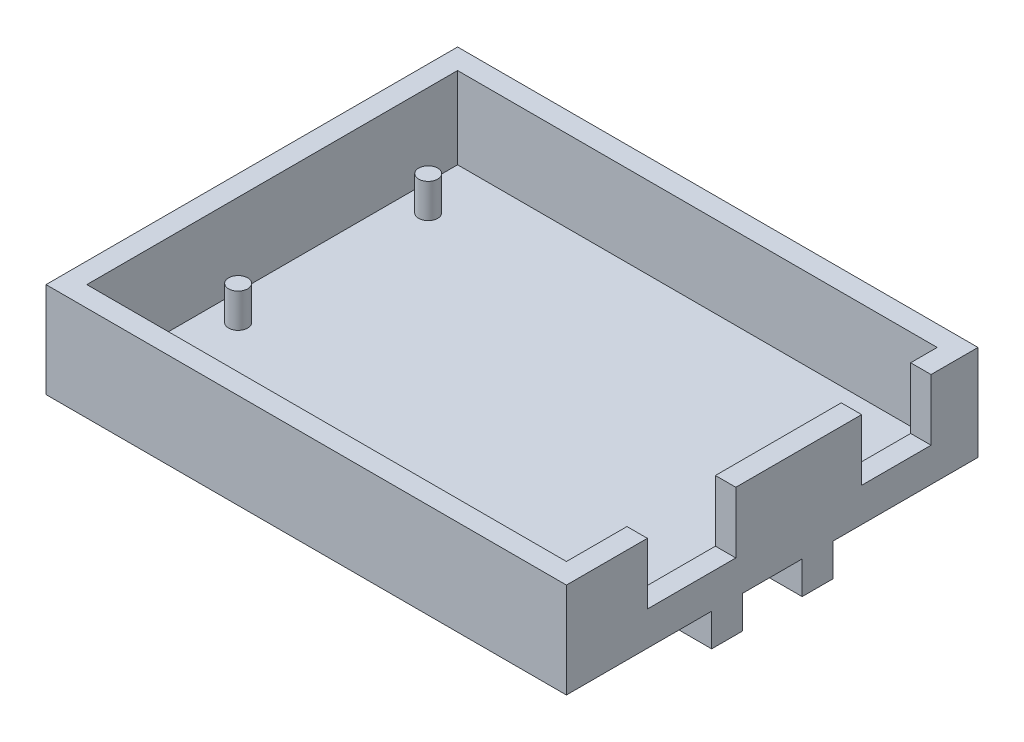
ISO-10303-21;
HEADER;
FILE_DESCRIPTION(('STEP AP214'),'2;1');
FILE_NAME('part.step','',(''),(''),'','','');
FILE_SCHEMA(('AUTOMOTIVE_DESIGN { 1 0 10303 214 1 1 1 1 }'));
ENDSEC;
DATA;
#1=APPLICATION_CONTEXT('core data for automotive mechanical design processes');
#2=APPLICATION_PROTOCOL_DEFINITION('international standard','automotive_design',2000,#1);
#3=PRODUCT_CONTEXT('',#1,'mechanical');
#4=PRODUCT('Part','Part','',(#3));
#5=PRODUCT_RELATED_PRODUCT_CATEGORY('part','',(#4));
#6=PRODUCT_DEFINITION_FORMATION('','',#4);
#7=PRODUCT_DEFINITION_CONTEXT('part definition',#1,'design');
#8=PRODUCT_DEFINITION('design','',#6,#7);
#9=PRODUCT_DEFINITION_SHAPE('','',#8);
#10=(LENGTH_UNIT() NAMED_UNIT(*) SI_UNIT(.MILLI.,.METRE.));
#11=(NAMED_UNIT(*) PLANE_ANGLE_UNIT() SI_UNIT($,.RADIAN.));
#12=(NAMED_UNIT(*) SI_UNIT($,.STERADIAN.) SOLID_ANGLE_UNIT());
#13=UNCERTAINTY_MEASURE_WITH_UNIT(LENGTH_MEASURE(1.E-05),#10,'distance_accuracy_value','');
#14=(GEOMETRIC_REPRESENTATION_CONTEXT(3) GLOBAL_UNCERTAINTY_ASSIGNED_CONTEXT((#13)) GLOBAL_UNIT_ASSIGNED_CONTEXT((#10,
#11,#12)) REPRESENTATION_CONTEXT('',''));
#15=CARTESIAN_POINT('',(0.,0.,0.));
#16=DIRECTION('',(0.,0.,1.));
#17=DIRECTION('',(1.,0.,0.));
#18=AXIS2_PLACEMENT_3D('',#15,#16,#17);
#19=CARTESIAN_POINT('',(0.,0.,0.));
#20=DIRECTION('',(0.,-1.,0.));
#21=DIRECTION('',(0.,0.,-1.));
#22=AXIS2_PLACEMENT_3D('',#19,#20,#21);
#23=PLANE('',#22);
#24=DIRECTION('',(-1.,0.,0.));
#25=VECTOR('',#24,1.);
#26=CARTESIAN_POINT('',(-38.25,0.,-8.9));
#27=LINE('',#26,#25);
#28=CARTESIAN_POINT('',(38.25,0.,-8.90000000000001));
#29=VERTEX_POINT('',#28);
#30=CARTESIAN_POINT('',(-38.25,0.,-8.90000000000001));
#31=VERTEX_POINT('',#30);
#32=EDGE_CURVE('E232',#29,#31,#27,.T.);
#33=ORIENTED_EDGE('',*,*,#32,.T.);
#34=DIRECTION('',(0.,0.,1.));
#35=VECTOR('',#34,1.);
#36=CARTESIAN_POINT('',(-38.25,0.,30.25));
#37=LINE('',#36,#35);
#38=CARTESIAN_POINT('',(-38.25,0.,-30.25));
#39=VERTEX_POINT('',#38);
#40=EDGE_CURVE('E208',#39,#31,#37,.T.);
#41=ORIENTED_EDGE('',*,*,#40,.F.);
#42=DIRECTION('',(-1.,0.,0.));
#43=VECTOR('',#42,1.);
#44=CARTESIAN_POINT('',(-38.25,0.,-30.25));
#45=LINE('',#44,#43);
#46=CARTESIAN_POINT('',(38.25,0.,-30.25));
#47=VERTEX_POINT('',#46);
#48=EDGE_CURVE('E365',#47,#39,#45,.T.);
#49=ORIENTED_EDGE('',*,*,#48,.F.);
#50=DIRECTION('',(0.,0.,-1.));
#51=VECTOR('',#50,1.);
#52=CARTESIAN_POINT('',(38.25,0.,30.25));
#53=LINE('',#52,#51);
#54=EDGE_CURVE('E53',#29,#47,#53,.T.);
#55=ORIENTED_EDGE('',*,*,#54,.F.);
#56=EDGE_LOOP('',(#33,#41,#49,#55));
#57=FACE_BOUND('',#56,.T.);
#58=ADVANCED_FACE('F38',(#57),#23,.T.);
#59=DIRECTION('',(-1.,0.,0.));
#60=VECTOR('',#59,1.);
#61=CARTESIAN_POINT('',(-38.25,0.,8.9));
#62=LINE('',#61,#60);
#63=CARTESIAN_POINT('',(38.25,0.,8.9));
#64=VERTEX_POINT('',#63);
#65=CARTESIAN_POINT('',(-38.25,0.,8.9));
#66=VERTEX_POINT('',#65);
#67=EDGE_CURVE('E245',#64,#66,#62,.T.);
#68=ORIENTED_EDGE('',*,*,#67,.F.);
#69=CARTESIAN_POINT('',(38.25,0.,30.25));
#70=VERTEX_POINT('',#69);
#71=EDGE_CURVE('E362',#70,#64,#53,.T.);
#72=ORIENTED_EDGE('',*,*,#71,.F.);
#73=DIRECTION('',(1.,0.,0.));
#74=VECTOR('',#73,1.);
#75=CARTESIAN_POINT('',(-38.25,0.,30.25));
#76=LINE('',#75,#74);
#77=CARTESIAN_POINT('',(-38.25,0.,30.25));
#78=VERTEX_POINT('',#77);
#79=EDGE_CURVE('E370',#78,#70,#76,.T.);
#80=ORIENTED_EDGE('',*,*,#79,.F.);
#81=EDGE_CURVE('E368',#66,#78,#37,.T.);
#82=ORIENTED_EDGE('',*,*,#81,.F.);
#83=EDGE_LOOP('',(#68,#72,#80,#82));
#84=FACE_BOUND('',#83,.T.);
#85=ADVANCED_FACE('F407',(#84),#23,.T.);
#86=CARTESIAN_POINT('',(0.,14.,0.));
#87=DIRECTION('',(0.,-1.,0.));
#88=DIRECTION('',(0.,0.,-1.));
#89=AXIS2_PLACEMENT_3D('',#86,#87,#88);
#90=PLANE('',#89);
#91=DIRECTION('',(0.,0.,-1.));
#92=VECTOR('',#91,1.);
#93=CARTESIAN_POINT('',(35.25,14.,-27.25));
#94=LINE('',#93,#92);
#95=CARTESIAN_POINT('',(35.25,14.,5.35));
#96=VERTEX_POINT('',#95);
#97=CARTESIAN_POINT('',(35.25,14.,-13.15));
#98=VERTEX_POINT('',#97);
#99=EDGE_CURVE('E334',#96,#98,#94,.T.);
#100=ORIENTED_EDGE('',*,*,#99,.F.);
#101=DIRECTION('',(1.,0.,0.));
#102=VECTOR('',#101,1.);
#103=CARTESIAN_POINT('',(-38.251,14.,5.35));
#104=LINE('',#103,#102);
#105=CARTESIAN_POINT('',(38.25,14.,5.35));
#106=VERTEX_POINT('',#105);
#107=EDGE_CURVE('E283',#96,#106,#104,.T.);
#108=ORIENTED_EDGE('',*,*,#107,.T.);
#109=DIRECTION('',(0.,0.,-1.));
#110=VECTOR('',#109,1.);
#111=CARTESIAN_POINT('',(38.25,14.,30.25));
#112=LINE('',#111,#110);
#113=CARTESIAN_POINT('',(38.25,14.,-13.15));
#114=VERTEX_POINT('',#113);
#115=EDGE_CURVE('E354',#106,#114,#112,.T.);
#116=ORIENTED_EDGE('',*,*,#115,.T.);
#117=DIRECTION('',(1.,0.,0.));
#118=VECTOR('',#117,1.);
#119=CARTESIAN_POINT('',(-38.251,14.,-13.15));
#120=LINE('',#119,#118);
#121=EDGE_CURVE('E298',#98,#114,#120,.T.);
#122=ORIENTED_EDGE('',*,*,#121,.F.);
#123=EDGE_LOOP('',(#100,#108,#116,#122));
#124=FACE_BOUND('',#123,.T.);
#125=ADVANCED_FACE('F423',(#124),#90,.F.);
#126=CARTESIAN_POINT('',(38.25,14.,30.25));
#127=DIRECTION('',(-1.,0.,0.));
#128=DIRECTION('',(0.,0.,1.));
#129=AXIS2_PLACEMENT_3D('',#126,#127,#128);
#130=PLANE('',#129);
#131=ORIENTED_EDGE('',*,*,#115,.F.);
#132=DIRECTION('',(0.,1.,0.));
#133=VECTOR('',#132,1.);
#134=CARTESIAN_POINT('',(38.25,14.,5.35));
#135=LINE('',#134,#133);
#136=CARTESIAN_POINT('',(38.25,5.,5.35));
#137=VERTEX_POINT('',#136);
#138=EDGE_CURVE('E280',#137,#106,#135,.T.);
#139=ORIENTED_EDGE('',*,*,#138,.F.);
#140=DIRECTION('',(0.,0.,-1.));
#141=VECTOR('',#140,1.);
#142=CARTESIAN_POINT('',(38.25,5.,18.35));
#143=LINE('',#142,#141);
#144=CARTESIAN_POINT('',(38.25,5.,18.35));
#145=VERTEX_POINT('',#144);
#146=EDGE_CURVE('E277',#145,#137,#143,.T.);
#147=ORIENTED_EDGE('',*,*,#146,.F.);
#148=DIRECTION('',(0.,-1.,0.));
#149=VECTOR('',#148,1.);
#150=CARTESIAN_POINT('',(38.25,14.,18.35));
#151=LINE('',#150,#149);
#152=CARTESIAN_POINT('',(38.25,14.,18.35));
#153=VERTEX_POINT('',#152);
#154=EDGE_CURVE('E274',#153,#145,#151,.T.);
#155=ORIENTED_EDGE('',*,*,#154,.F.);
#156=CARTESIAN_POINT('',(38.25,14.,30.25));
#157=VERTEX_POINT('',#156);
#158=EDGE_CURVE('E350',#157,#153,#112,.T.);
#159=ORIENTED_EDGE('',*,*,#158,.F.);
#160=DIRECTION('',(0.,-1.,0.));
#161=VECTOR('',#160,1.);
#162=CARTESIAN_POINT('',(38.25,14.,30.25));
#163=LINE('',#162,#161);
#164=EDGE_CURVE('E361',#157,#70,#163,.T.);
#165=ORIENTED_EDGE('',*,*,#164,.T.);
#166=ORIENTED_EDGE('',*,*,#71,.T.);
#167=DIRECTION('',(0.,1.,0.));
#168=VECTOR('',#167,1.);
#169=CARTESIAN_POINT('',(38.25,-4.8,8.9));
#170=LINE('',#169,#168);
#171=CARTESIAN_POINT('',(38.25,-4.8,8.9));
#172=VERTEX_POINT('',#171);
#173=EDGE_CURVE('E258',#172,#64,#170,.T.);
#174=ORIENTED_EDGE('',*,*,#173,.F.);
#175=DIRECTION('',(0.,0.,1.));
#176=VECTOR('',#175,1.);
#177=CARTESIAN_POINT('',(38.25,-4.8,4.4));
#178=LINE('',#177,#176);
#179=CARTESIAN_POINT('',(38.25,-4.8,4.4));
#180=VERTEX_POINT('',#179);
#181=EDGE_CURVE('E247',#180,#172,#178,.T.);
#182=ORIENTED_EDGE('',*,*,#181,.F.);
#183=DIRECTION('',(0.,1.,0.));
#184=VECTOR('',#183,1.);
#185=CARTESIAN_POINT('',(38.25,-4.8,4.4));
#186=LINE('',#185,#184);
#187=CARTESIAN_POINT('',(38.25,0.,4.4));
#188=VERTEX_POINT('',#187);
#189=EDGE_CURVE('E261',#180,#188,#186,.T.);
#190=ORIENTED_EDGE('',*,*,#189,.T.);
#191=CARTESIAN_POINT('',(38.25,0.,-4.4));
#192=VERTEX_POINT('',#191);
#193=EDGE_CURVE('E366',#188,#192,#53,.T.);
#194=ORIENTED_EDGE('',*,*,#193,.T.);
#195=DIRECTION('',(0.,1.,0.));
#196=VECTOR('',#195,1.);
#197=CARTESIAN_POINT('',(38.25,-4.8,-4.4));
#198=LINE('',#197,#196);
#199=CARTESIAN_POINT('',(38.25,-4.8,-4.4));
#200=VERTEX_POINT('',#199);
#201=EDGE_CURVE('E237',#200,#192,#198,.T.);
#202=ORIENTED_EDGE('',*,*,#201,.F.);
#203=DIRECTION('',(0.,0.,-1.));
#204=VECTOR('',#203,1.);
#205=CARTESIAN_POINT('',(38.25,-4.8,-4.4));
#206=LINE('',#205,#204);
#207=CARTESIAN_POINT('',(38.25,-4.8,-8.9));
#208=VERTEX_POINT('',#207);
#209=EDGE_CURVE('E225',#200,#208,#206,.T.);
#210=ORIENTED_EDGE('',*,*,#209,.T.);
#211=DIRECTION('',(0.,1.,0.));
#212=VECTOR('',#211,1.);
#213=CARTESIAN_POINT('',(38.25,-4.8,-8.9));
#214=LINE('',#213,#212);
#215=EDGE_CURVE('E213',#208,#29,#214,.T.);
#216=ORIENTED_EDGE('',*,*,#215,.T.);
#217=ORIENTED_EDGE('',*,*,#54,.T.);
#218=DIRECTION('',(0.,-1.,0.));
#219=VECTOR('',#218,1.);
#220=CARTESIAN_POINT('',(38.25,14.,-30.25));
#221=LINE('',#220,#219);
#222=CARTESIAN_POINT('',(38.25,14.,-30.25));
#223=VERTEX_POINT('',#222);
#224=EDGE_CURVE('E11',#223,#47,#221,.T.);
#225=ORIENTED_EDGE('',*,*,#224,.F.);
#226=CARTESIAN_POINT('',(38.25,14.,-23.35));
#227=VERTEX_POINT('',#226);
#228=EDGE_CURVE('E355',#227,#223,#112,.T.);
#229=ORIENTED_EDGE('',*,*,#228,.F.);
#230=DIRECTION('',(0.,1.,0.));
#231=VECTOR('',#230,1.);
#232=CARTESIAN_POINT('',(38.25,14.,-23.35));
#233=LINE('',#232,#231);
#234=CARTESIAN_POINT('',(38.25,5.,-23.35));
#235=VERTEX_POINT('',#234);
#236=EDGE_CURVE('E308',#235,#227,#233,.T.);
#237=ORIENTED_EDGE('',*,*,#236,.F.);
#238=DIRECTION('',(0.,0.,-1.));
#239=VECTOR('',#238,1.);
#240=CARTESIAN_POINT('',(38.25,5.,-23.35));
#241=LINE('',#240,#239);
#242=CARTESIAN_POINT('',(38.25,5.,-13.15));
#243=VERTEX_POINT('',#242);
#244=EDGE_CURVE('E297',#243,#235,#241,.T.);
#245=ORIENTED_EDGE('',*,*,#244,.F.);
#246=DIRECTION('',(0.,-1.,0.));
#247=VECTOR('',#246,1.);
#248=CARTESIAN_POINT('',(38.25,14.,-13.15));
#249=LINE('',#248,#247);
#250=EDGE_CURVE('E305',#114,#243,#249,.T.);
#251=ORIENTED_EDGE('',*,*,#250,.F.);
#252=EDGE_LOOP('',(#131,#139,#147,#155,#159,#165,#166,#174,#182,#190,#194,#202,#210,#216,#217,
#225,#229,#237,#245,#251));
#253=FACE_BOUND('',#252,.T.);
#254=ADVANCED_FACE('F40',(#253),#130,.F.);
#255=CARTESIAN_POINT('',(-38.25,14.,-30.25));
#256=DIRECTION('',(0.,0.,1.));
#257=DIRECTION('',(1.,0.,0.));
#258=AXIS2_PLACEMENT_3D('',#255,#256,#257);
#259=PLANE('',#258);
#260=ORIENTED_EDGE('',*,*,#48,.T.);
#261=DIRECTION('',(0.,-1.,0.));
#262=VECTOR('',#261,1.);
#263=CARTESIAN_POINT('',(-38.25,14.,-30.25));
#264=LINE('',#263,#262);
#265=CARTESIAN_POINT('',(-38.25,14.,-30.25));
#266=VERTEX_POINT('',#265);
#267=EDGE_CURVE('E46',#266,#39,#264,.T.);
#268=ORIENTED_EDGE('',*,*,#267,.F.);
#269=DIRECTION('',(-1.,0.,0.));
#270=VECTOR('',#269,1.);
#271=CARTESIAN_POINT('',(-38.25,14.,-30.25));
#272=LINE('',#271,#270);
#273=EDGE_CURVE('E353',#223,#266,#272,.T.);
#274=ORIENTED_EDGE('',*,*,#273,.F.);
#275=ORIENTED_EDGE('',*,*,#224,.T.);
#276=EDGE_LOOP('',(#260,#268,#274,#275));
#277=FACE_BOUND('',#276,.T.);
#278=ADVANCED_FACE('F383',(#277),#259,.F.);
#279=CARTESIAN_POINT('',(-38.25,14.,30.25));
#280=DIRECTION('',(1.,0.,0.));
#281=DIRECTION('',(0.,0.,-1.));
#282=AXIS2_PLACEMENT_3D('',#279,#280,#281);
#283=PLANE('',#282);
#284=ORIENTED_EDGE('',*,*,#40,.T.);
#285=DIRECTION('',(0.,1.,0.));
#286=VECTOR('',#285,1.);
#287=CARTESIAN_POINT('',(-38.25,-4.8,-8.9));
#288=LINE('',#287,#286);
#289=CARTESIAN_POINT('',(-38.25,-4.8,-8.9));
#290=VERTEX_POINT('',#289);
#291=EDGE_CURVE('E200',#290,#31,#288,.T.);
#292=ORIENTED_EDGE('',*,*,#291,.F.);
#293=DIRECTION('',(0.,0.,1.));
#294=VECTOR('',#293,1.);
#295=CARTESIAN_POINT('',(-38.25,-4.8,-4.4));
#296=LINE('',#295,#294);
#297=CARTESIAN_POINT('',(-38.25,-4.8,-4.4));
#298=VERTEX_POINT('',#297);
#299=EDGE_CURVE('E204',#290,#298,#296,.T.);
#300=ORIENTED_EDGE('',*,*,#299,.T.);
#301=DIRECTION('',(0.,1.,0.));
#302=VECTOR('',#301,1.);
#303=CARTESIAN_POINT('',(-38.25,-4.8,-4.4));
#304=LINE('',#303,#302);
#305=CARTESIAN_POINT('',(-38.25,0.,-4.4));
#306=VERTEX_POINT('',#305);
#307=EDGE_CURVE('E231',#298,#306,#304,.T.);
#308=ORIENTED_EDGE('',*,*,#307,.T.);
#309=CARTESIAN_POINT('',(-38.25,0.,4.4));
#310=VERTEX_POINT('',#309);
#311=EDGE_CURVE('E371',#306,#310,#37,.T.);
#312=ORIENTED_EDGE('',*,*,#311,.T.);
#313=DIRECTION('',(0.,1.,0.));
#314=VECTOR('',#313,1.);
#315=CARTESIAN_POINT('',(-38.25,-4.8,4.4));
#316=LINE('',#315,#314);
#317=CARTESIAN_POINT('',(-38.25,-4.8,4.4));
#318=VERTEX_POINT('',#317);
#319=EDGE_CURVE('E264',#318,#310,#316,.T.);
#320=ORIENTED_EDGE('',*,*,#319,.F.);
#321=DIRECTION('',(0.,0.,-1.));
#322=VECTOR('',#321,1.);
#323=CARTESIAN_POINT('',(-38.25,-4.8,4.4));
#324=LINE('',#323,#322);
#325=CARTESIAN_POINT('',(-38.25,-4.8,8.9));
#326=VERTEX_POINT('',#325);
#327=EDGE_CURVE('E241',#326,#318,#324,.T.);
#328=ORIENTED_EDGE('',*,*,#327,.F.);
#329=DIRECTION('',(0.,1.,0.));
#330=VECTOR('',#329,1.);
#331=CARTESIAN_POINT('',(-38.25,-4.8,8.9));
#332=LINE('',#331,#330);
#333=EDGE_CURVE('E251',#326,#66,#332,.T.);
#334=ORIENTED_EDGE('',*,*,#333,.T.);
#335=ORIENTED_EDGE('',*,*,#81,.T.);
#336=DIRECTION('',(0.,-1.,0.));
#337=VECTOR('',#336,1.);
#338=CARTESIAN_POINT('',(-38.25,14.,30.25));
#339=LINE('',#338,#337);
#340=CARTESIAN_POINT('',(-38.25,14.,30.25));
#341=VERTEX_POINT('',#340);
#342=EDGE_CURVE('E375',#341,#78,#339,.T.);
#343=ORIENTED_EDGE('',*,*,#342,.F.);
#344=DIRECTION('',(0.,0.,1.));
#345=VECTOR('',#344,1.);
#346=CARTESIAN_POINT('',(-38.25,14.,30.25));
#347=LINE('',#346,#345);
#348=EDGE_CURVE('E357',#266,#341,#347,.T.);
#349=ORIENTED_EDGE('',*,*,#348,.F.);
#350=ORIENTED_EDGE('',*,*,#267,.T.);
#351=EDGE_LOOP('',(#284,#292,#300,#308,#312,#320,#328,#334,#335,#343,#349,#350));
#352=FACE_BOUND('',#351,.T.);
#353=ADVANCED_FACE('F202',(#352),#283,.F.);
#354=CARTESIAN_POINT('',(-38.25,14.,30.25));
#355=DIRECTION('',(0.,0.,-1.));
#356=DIRECTION('',(-1.,0.,0.));
#357=AXIS2_PLACEMENT_3D('',#354,#355,#356);
#358=PLANE('',#357);
#359=ORIENTED_EDGE('',*,*,#79,.T.);
#360=ORIENTED_EDGE('',*,*,#164,.F.);
#361=DIRECTION('',(1.,0.,0.));
#362=VECTOR('',#361,1.);
#363=CARTESIAN_POINT('',(-38.25,14.,30.25));
#364=LINE('',#363,#362);
#365=EDGE_CURVE('E359',#341,#157,#364,.T.);
#366=ORIENTED_EDGE('',*,*,#365,.F.);
#367=ORIENTED_EDGE('',*,*,#342,.T.);
#368=EDGE_LOOP('',(#359,#360,#366,#367));
#369=FACE_BOUND('',#368,.T.);
#370=ADVANCED_FACE('F414',(#369),#358,.F.);
#371=ORIENTED_EDGE('',*,*,#158,.T.);
#372=DIRECTION('',(1.,0.,0.));
#373=VECTOR('',#372,1.);
#374=CARTESIAN_POINT('',(-38.251,14.,18.35));
#375=LINE('',#374,#373);
#376=CARTESIAN_POINT('',(35.25,14.,18.35));
#377=VERTEX_POINT('',#376);
#378=EDGE_CURVE('E282',#377,#153,#375,.T.);
#379=ORIENTED_EDGE('',*,*,#378,.F.);
#380=CARTESIAN_POINT('',(35.25,14.,27.25));
#381=VERTEX_POINT('',#380);
#382=EDGE_CURVE('E330',#381,#377,#94,.T.);
#383=ORIENTED_EDGE('',*,*,#382,.F.);
#384=DIRECTION('',(1.,0.,0.));
#385=VECTOR('',#384,1.);
#386=CARTESIAN_POINT('',(-35.25,14.,27.25));
#387=LINE('',#386,#385);
#388=CARTESIAN_POINT('',(-35.25,14.,27.25));
#389=VERTEX_POINT('',#388);
#390=EDGE_CURVE('E320',#389,#381,#387,.T.);
#391=ORIENTED_EDGE('',*,*,#390,.F.);
#392=DIRECTION('',(0.,0.,1.));
#393=VECTOR('',#392,1.);
#394=CARTESIAN_POINT('',(-35.25,14.,-27.25));
#395=LINE('',#394,#393);
#396=CARTESIAN_POINT('',(-35.25,14.,-27.25));
#397=VERTEX_POINT('',#396);
#398=EDGE_CURVE('E337',#397,#389,#395,.T.);
#399=ORIENTED_EDGE('',*,*,#398,.F.);
#400=DIRECTION('',(-1.,0.,0.));
#401=VECTOR('',#400,1.);
#402=CARTESIAN_POINT('',(-35.25,14.,-27.25));
#403=LINE('',#402,#401);
#404=CARTESIAN_POINT('',(35.25,14.,-27.25));
#405=VERTEX_POINT('',#404);
#406=EDGE_CURVE('E333',#405,#397,#403,.T.);
#407=ORIENTED_EDGE('',*,*,#406,.F.);
#408=CARTESIAN_POINT('',(35.25,14.,-23.35));
#409=VERTEX_POINT('',#408);
#410=EDGE_CURVE('E293',#409,#405,#94,.T.);
#411=ORIENTED_EDGE('',*,*,#410,.F.);
#412=DIRECTION('',(1.,0.,0.));
#413=VECTOR('',#412,1.);
#414=CARTESIAN_POINT('',(-38.251,14.,-23.35));
#415=LINE('',#414,#413);
#416=EDGE_CURVE('E294',#409,#227,#415,.T.);
#417=ORIENTED_EDGE('',*,*,#416,.T.);
#418=ORIENTED_EDGE('',*,*,#228,.T.);
#419=ORIENTED_EDGE('',*,*,#273,.T.);
#420=ORIENTED_EDGE('',*,*,#348,.T.);
#421=ORIENTED_EDGE('',*,*,#365,.T.);
#422=EDGE_LOOP('',(#371,#379,#383,#391,#399,#407,#411,#417,#418,#419,#420,#421));
#423=FACE_BOUND('',#422,.T.);
#424=ADVANCED_FACE('F416',(#423),#90,.F.);
#425=DIRECTION('',(1.,0.,0.));
#426=VECTOR('',#425,1.);
#427=CARTESIAN_POINT('',(-38.25,0.,-4.4));
#428=LINE('',#427,#426);
#429=EDGE_CURVE('E61',#306,#192,#428,.T.);
#430=ORIENTED_EDGE('',*,*,#429,.T.);
#431=ORIENTED_EDGE('',*,*,#193,.F.);
#432=DIRECTION('',(1.,0.,0.));
#433=VECTOR('',#432,1.);
#434=CARTESIAN_POINT('',(-38.25,0.,4.4));
#435=LINE('',#434,#433);
#436=EDGE_CURVE('E212',#310,#188,#435,.T.);
#437=ORIENTED_EDGE('',*,*,#436,.F.);
#438=ORIENTED_EDGE('',*,*,#311,.F.);
#439=EDGE_LOOP('',(#430,#431,#437,#438));
#440=FACE_BOUND('',#439,.T.);
#441=ADVANCED_FACE('F395',(#440),#23,.T.);
#442=CARTESIAN_POINT('',(35.25,2.,-27.25));
#443=DIRECTION('',(1.,0.,0.));
#444=DIRECTION('',(0.,0.,-1.));
#445=AXIS2_PLACEMENT_3D('',#442,#443,#444);
#446=PLANE('',#445);
#447=DIRECTION('',(0.,0.,1.));
#448=VECTOR('',#447,1.);
#449=CARTESIAN_POINT('',(35.25,5.,18.35));
#450=LINE('',#449,#448);
#451=CARTESIAN_POINT('',(35.25,5.,5.35));
#452=VERTEX_POINT('',#451);
#453=CARTESIAN_POINT('',(35.25,5.,18.35));
#454=VERTEX_POINT('',#453);
#455=EDGE_CURVE('E268',#452,#454,#450,.T.);
#456=ORIENTED_EDGE('',*,*,#455,.F.);
#457=DIRECTION('',(0.,-1.,0.));
#458=VECTOR('',#457,1.);
#459=CARTESIAN_POINT('',(35.25,14.,5.35));
#460=LINE('',#459,#458);
#461=EDGE_CURVE('E270',#96,#452,#460,.T.);
#462=ORIENTED_EDGE('',*,*,#461,.F.);
#463=ORIENTED_EDGE('',*,*,#99,.T.);
#464=DIRECTION('',(0.,1.,0.));
#465=VECTOR('',#464,1.);
#466=CARTESIAN_POINT('',(35.25,14.,-13.15));
#467=LINE('',#466,#465);
#468=CARTESIAN_POINT('',(35.25,5.,-13.15));
#469=VERTEX_POINT('',#468);
#470=EDGE_CURVE('E271',#469,#98,#467,.T.);
#471=ORIENTED_EDGE('',*,*,#470,.F.);
#472=DIRECTION('',(0.,0.,1.));
#473=VECTOR('',#472,1.);
#474=CARTESIAN_POINT('',(35.25,5.,-23.35));
#475=LINE('',#474,#473);
#476=CARTESIAN_POINT('',(35.25,5.,-23.35));
#477=VERTEX_POINT('',#476);
#478=EDGE_CURVE('E313',#477,#469,#475,.T.);
#479=ORIENTED_EDGE('',*,*,#478,.F.);
#480=DIRECTION('',(0.,-1.,0.));
#481=VECTOR('',#480,1.);
#482=CARTESIAN_POINT('',(35.25,14.,-23.35));
#483=LINE('',#482,#481);
#484=EDGE_CURVE('E310',#409,#477,#483,.T.);
#485=ORIENTED_EDGE('',*,*,#484,.F.);
#486=ORIENTED_EDGE('',*,*,#410,.T.);
#487=DIRECTION('',(0.,1.,0.));
#488=VECTOR('',#487,1.);
#489=CARTESIAN_POINT('',(35.25,2.,-27.25));
#490=LINE('',#489,#488);
#491=CARTESIAN_POINT('',(35.25,2.,-27.25));
#492=VERTEX_POINT('',#491);
#493=EDGE_CURVE('E329',#492,#405,#490,.T.);
#494=ORIENTED_EDGE('',*,*,#493,.F.);
#495=DIRECTION('',(0.,0.,-1.));
#496=VECTOR('',#495,1.);
#497=CARTESIAN_POINT('',(35.25,2.,-27.25));
#498=LINE('',#497,#496);
#499=CARTESIAN_POINT('',(35.25,2.,27.25));
#500=VERTEX_POINT('',#499);
#501=EDGE_CURVE('E316',#500,#492,#498,.T.);
#502=ORIENTED_EDGE('',*,*,#501,.F.);
#503=DIRECTION('',(0.,1.,0.));
#504=VECTOR('',#503,1.);
#505=CARTESIAN_POINT('',(35.25,2.,27.25));
#506=LINE('',#505,#504);
#507=EDGE_CURVE('E342',#500,#381,#506,.T.);
#508=ORIENTED_EDGE('',*,*,#507,.T.);
#509=ORIENTED_EDGE('',*,*,#382,.T.);
#510=DIRECTION('',(0.,1.,0.));
#511=VECTOR('',#510,1.);
#512=CARTESIAN_POINT('',(35.25,14.,18.35));
#513=LINE('',#512,#511);
#514=EDGE_CURVE('E286',#454,#377,#513,.T.);
#515=ORIENTED_EDGE('',*,*,#514,.F.);
#516=EDGE_LOOP('',(#456,#462,#463,#471,#479,#485,#486,#494,#502,#508,#509,#515));
#517=FACE_BOUND('',#516,.T.);
#518=ADVANCED_FACE('F436',(#517),#446,.F.);
#519=CARTESIAN_POINT('',(-35.25,2.,27.25));
#520=DIRECTION('',(0.,0.,1.));
#521=DIRECTION('',(1.,0.,0.));
#522=AXIS2_PLACEMENT_3D('',#519,#520,#521);
#523=PLANE('',#522);
#524=ORIENTED_EDGE('',*,*,#390,.T.);
#525=ORIENTED_EDGE('',*,*,#507,.F.);
#526=DIRECTION('',(1.,0.,0.));
#527=VECTOR('',#526,1.);
#528=CARTESIAN_POINT('',(-35.25,2.,27.25));
#529=LINE('',#528,#527);
#530=CARTESIAN_POINT('',(-35.25,2.,27.25));
#531=VERTEX_POINT('',#530);
#532=EDGE_CURVE('E326',#531,#500,#529,.T.);
#533=ORIENTED_EDGE('',*,*,#532,.F.);
#534=DIRECTION('',(0.,1.,0.));
#535=VECTOR('',#534,1.);
#536=CARTESIAN_POINT('',(-35.25,2.,27.25));
#537=LINE('',#536,#535);
#538=EDGE_CURVE('E344',#531,#389,#537,.T.);
#539=ORIENTED_EDGE('',*,*,#538,.T.);
#540=EDGE_LOOP('',(#524,#525,#533,#539));
#541=FACE_BOUND('',#540,.T.);
#542=ADVANCED_FACE('F455',(#541),#523,.F.);
#543=CARTESIAN_POINT('',(-35.25,2.,-27.25));
#544=DIRECTION('',(-1.,0.,0.));
#545=DIRECTION('',(0.,0.,1.));
#546=AXIS2_PLACEMENT_3D('',#543,#544,#545);
#547=PLANE('',#546);
#548=ORIENTED_EDGE('',*,*,#398,.T.);
#549=ORIENTED_EDGE('',*,*,#538,.F.);
#550=DIRECTION('',(0.,0.,1.));
#551=VECTOR('',#550,1.);
#552=CARTESIAN_POINT('',(-35.25,2.,-27.25));
#553=LINE('',#552,#551);
#554=CARTESIAN_POINT('',(-35.25,2.,-27.25));
#555=VERTEX_POINT('',#554);
#556=EDGE_CURVE('E323',#555,#531,#553,.T.);
#557=ORIENTED_EDGE('',*,*,#556,.F.);
#558=DIRECTION('',(0.,1.,0.));
#559=VECTOR('',#558,1.);
#560=CARTESIAN_POINT('',(-35.25,2.,-27.25));
#561=LINE('',#560,#559);
#562=EDGE_CURVE('E346',#555,#397,#561,.T.);
#563=ORIENTED_EDGE('',*,*,#562,.T.);
#564=EDGE_LOOP('',(#548,#549,#557,#563));
#565=FACE_BOUND('',#564,.T.);
#566=ADVANCED_FACE('F448',(#565),#547,.F.);
#567=CARTESIAN_POINT('',(-35.25,2.,-27.25));
#568=DIRECTION('',(0.,0.,-1.));
#569=DIRECTION('',(-1.,0.,0.));
#570=AXIS2_PLACEMENT_3D('',#567,#568,#569);
#571=PLANE('',#570);
#572=ORIENTED_EDGE('',*,*,#406,.T.);
#573=ORIENTED_EDGE('',*,*,#562,.F.);
#574=DIRECTION('',(-1.,0.,0.));
#575=VECTOR('',#574,1.);
#576=CARTESIAN_POINT('',(-35.25,2.,-27.25));
#577=LINE('',#576,#575);
#578=EDGE_CURVE('E319',#492,#555,#577,.T.);
#579=ORIENTED_EDGE('',*,*,#578,.F.);
#580=ORIENTED_EDGE('',*,*,#493,.T.);
#581=EDGE_LOOP('',(#572,#573,#579,#580));
#582=FACE_BOUND('',#581,.T.);
#583=ADVANCED_FACE('F443',(#582),#571,.F.);
#584=CARTESIAN_POINT('',(0.,2.,0.));
#585=DIRECTION('',(0.,1.,0.));
#586=DIRECTION('',(0.,0.,1.));
#587=AXIS2_PLACEMENT_3D('',#584,#585,#586);
#588=PLANE('',#587);
#589=CARTESIAN_POINT('',(-31.29,2.,-18.97));
#590=DIRECTION('',(0.,1.,0.));
#591=DIRECTION('',(0.,0.,1.));
#592=AXIS2_PLACEMENT_3D('',#589,#590,#591);
#593=CIRCLE('',#592,1.4);
#594=CARTESIAN_POINT('',(-31.29,2.,-17.57));
#595=VERTEX_POINT('',#594);
#596=EDGE_CURVE('E743',#595,#595,#593,.T.);
#597=ORIENTED_EDGE('',*,*,#596,.F.);
#598=EDGE_LOOP('',(#597));
#599=FACE_BOUND('',#598,.T.);
#600=CARTESIAN_POINT('',(-31.29,2.,8.97));
#601=DIRECTION('',(0.,1.,0.));
#602=DIRECTION('',(0.,0.,1.));
#603=AXIS2_PLACEMENT_3D('',#600,#601,#602);
#604=CIRCLE('',#603,1.4);
#605=CARTESIAN_POINT('',(-31.29,2.,10.37));
#606=VERTEX_POINT('',#605);
#607=EDGE_CURVE('E746',#606,#606,#604,.T.);
#608=ORIENTED_EDGE('',*,*,#607,.F.);
#609=EDGE_LOOP('',(#608));
#610=FACE_BOUND('',#609,.T.);
#611=ORIENTED_EDGE('',*,*,#501,.T.);
#612=ORIENTED_EDGE('',*,*,#578,.T.);
#613=ORIENTED_EDGE('',*,*,#556,.T.);
#614=ORIENTED_EDGE('',*,*,#532,.T.);
#615=EDGE_LOOP('',(#611,#612,#613,#614));
#616=FACE_BOUND('',#615,.T.);
#617=ADVANCED_FACE('F452',(#599,#610,#616),#588,.T.);
#618=CARTESIAN_POINT('',(-38.251,14.,-23.35));
#619=DIRECTION('',(0.,0.,-1.));
#620=DIRECTION('',(-1.,0.,0.));
#621=AXIS2_PLACEMENT_3D('',#618,#619,#620);
#622=PLANE('',#621);
#623=ORIENTED_EDGE('',*,*,#484,.T.);
#624=DIRECTION('',(1.,0.,0.));
#625=VECTOR('',#624,1.);
#626=CARTESIAN_POINT('',(-38.251,5.,-23.35));
#627=LINE('',#626,#625);
#628=EDGE_CURVE('E267',#477,#235,#627,.T.);
#629=ORIENTED_EDGE('',*,*,#628,.T.);
#630=ORIENTED_EDGE('',*,*,#236,.T.);
#631=ORIENTED_EDGE('',*,*,#416,.F.);
#632=EDGE_LOOP('',(#623,#629,#630,#631));
#633=FACE_BOUND('',#632,.T.);
#634=ADVANCED_FACE('F563',(#633),#622,.F.);
#635=CARTESIAN_POINT('',(-38.251,5.,-23.35));
#636=DIRECTION('',(0.,-1.,0.));
#637=DIRECTION('',(0.,0.,-1.));
#638=AXIS2_PLACEMENT_3D('',#635,#636,#637);
#639=PLANE('',#638);
#640=ORIENTED_EDGE('',*,*,#478,.T.);
#641=DIRECTION('',(1.,0.,0.));
#642=VECTOR('',#641,1.);
#643=CARTESIAN_POINT('',(-38.251,5.,-13.15));
#644=LINE('',#643,#642);
#645=EDGE_CURVE('E300',#469,#243,#644,.T.);
#646=ORIENTED_EDGE('',*,*,#645,.T.);
#647=ORIENTED_EDGE('',*,*,#244,.T.);
#648=ORIENTED_EDGE('',*,*,#628,.F.);
#649=EDGE_LOOP('',(#640,#646,#647,#648));
#650=FACE_BOUND('',#649,.T.);
#651=ADVANCED_FACE('F470',(#650),#639,.F.);
#652=CARTESIAN_POINT('',(-38.251,14.,-13.15));
#653=DIRECTION('',(0.,0.,1.));
#654=DIRECTION('',(0.,-1.,0.));
#655=AXIS2_PLACEMENT_3D('',#652,#653,#654);
#656=PLANE('',#655);
#657=ORIENTED_EDGE('',*,*,#470,.T.);
#658=ORIENTED_EDGE('',*,*,#121,.T.);
#659=ORIENTED_EDGE('',*,*,#250,.T.);
#660=ORIENTED_EDGE('',*,*,#645,.F.);
#661=EDGE_LOOP('',(#657,#658,#659,#660));
#662=FACE_BOUND('',#661,.T.);
#663=ADVANCED_FACE('F431',(#662),#656,.F.);
#664=CARTESIAN_POINT('',(-38.251,14.,5.35));
#665=DIRECTION('',(0.,0.,-1.));
#666=DIRECTION('',(0.,1.,0.));
#667=AXIS2_PLACEMENT_3D('',#664,#665,#666);
#668=PLANE('',#667);
#669=ORIENTED_EDGE('',*,*,#461,.T.);
#670=DIRECTION('',(1.,0.,0.));
#671=VECTOR('',#670,1.);
#672=CARTESIAN_POINT('',(-38.251,5.,5.35));
#673=LINE('',#672,#671);
#674=EDGE_CURVE('E287',#452,#137,#673,.T.);
#675=ORIENTED_EDGE('',*,*,#674,.T.);
#676=ORIENTED_EDGE('',*,*,#138,.T.);
#677=ORIENTED_EDGE('',*,*,#107,.F.);
#678=EDGE_LOOP('',(#669,#675,#676,#677));
#679=FACE_BOUND('',#678,.T.);
#680=ADVANCED_FACE('F462',(#679),#668,.F.);
#681=CARTESIAN_POINT('',(-38.251,5.,18.35));
#682=DIRECTION('',(0.,-1.,0.));
#683=DIRECTION('',(0.,0.,-1.));
#684=AXIS2_PLACEMENT_3D('',#681,#682,#683);
#685=PLANE('',#684);
#686=ORIENTED_EDGE('',*,*,#455,.T.);
#687=DIRECTION('',(1.,0.,0.));
#688=VECTOR('',#687,1.);
#689=CARTESIAN_POINT('',(-38.251,5.,18.35));
#690=LINE('',#689,#688);
#691=EDGE_CURVE('E289',#454,#145,#690,.T.);
#692=ORIENTED_EDGE('',*,*,#691,.T.);
#693=ORIENTED_EDGE('',*,*,#146,.T.);
#694=ORIENTED_EDGE('',*,*,#674,.F.);
#695=EDGE_LOOP('',(#686,#692,#693,#694));
#696=FACE_BOUND('',#695,.T.);
#697=ADVANCED_FACE('F460',(#696),#685,.F.);
#698=CARTESIAN_POINT('',(-38.251,14.,18.35));
#699=DIRECTION('',(0.,0.,1.));
#700=DIRECTION('',(1.,0.,0.));
#701=AXIS2_PLACEMENT_3D('',#698,#699,#700);
#702=PLANE('',#701);
#703=ORIENTED_EDGE('',*,*,#514,.T.);
#704=ORIENTED_EDGE('',*,*,#378,.T.);
#705=ORIENTED_EDGE('',*,*,#154,.T.);
#706=ORIENTED_EDGE('',*,*,#691,.F.);
#707=EDGE_LOOP('',(#703,#704,#705,#706));
#708=FACE_BOUND('',#707,.T.);
#709=ADVANCED_FACE('F457',(#708),#702,.F.);
#710=CARTESIAN_POINT('',(-38.25,-4.8,4.4));
#711=DIRECTION('',(0.,0.,1.));
#712=DIRECTION('',(1.,0.,0.));
#713=AXIS2_PLACEMENT_3D('',#710,#711,#712);
#714=PLANE('',#713);
#715=ORIENTED_EDGE('',*,*,#436,.T.);
#716=ORIENTED_EDGE('',*,*,#189,.F.);
#717=DIRECTION('',(1.,0.,0.));
#718=VECTOR('',#717,1.);
#719=CARTESIAN_POINT('',(-38.25,-4.8,4.4));
#720=LINE('',#719,#718);
#721=EDGE_CURVE('E244',#318,#180,#720,.T.);
#722=ORIENTED_EDGE('',*,*,#721,.F.);
#723=ORIENTED_EDGE('',*,*,#319,.T.);
#724=EDGE_LOOP('',(#715,#716,#722,#723));
#725=FACE_BOUND('',#724,.T.);
#726=ADVANCED_FACE('F397',(#725),#714,.F.);
#727=CARTESIAN_POINT('',(-38.25,-4.8,8.9));
#728=DIRECTION('',(0.,0.,-1.));
#729=DIRECTION('',(-1.,0.,0.));
#730=AXIS2_PLACEMENT_3D('',#727,#728,#729);
#731=PLANE('',#730);
#732=ORIENTED_EDGE('',*,*,#67,.T.);
#733=ORIENTED_EDGE('',*,*,#333,.F.);
#734=DIRECTION('',(-1.,0.,0.));
#735=VECTOR('',#734,1.);
#736=CARTESIAN_POINT('',(-38.25,-4.8,8.9));
#737=LINE('',#736,#735);
#738=EDGE_CURVE('E249',#172,#326,#737,.T.);
#739=ORIENTED_EDGE('',*,*,#738,.F.);
#740=ORIENTED_EDGE('',*,*,#173,.T.);
#741=EDGE_LOOP('',(#732,#733,#739,#740));
#742=FACE_BOUND('',#741,.T.);
#743=ADVANCED_FACE('F403',(#742),#731,.F.);
#744=CARTESIAN_POINT('',(0.,-4.8,0.));
#745=DIRECTION('',(0.,1.,0.));
#746=DIRECTION('',(0.,0.,1.));
#747=AXIS2_PLACEMENT_3D('',#744,#745,#746);
#748=PLANE('',#747);
#749=ORIENTED_EDGE('',*,*,#327,.T.);
#750=ORIENTED_EDGE('',*,*,#721,.T.);
#751=ORIENTED_EDGE('',*,*,#181,.T.);
#752=ORIENTED_EDGE('',*,*,#738,.T.);
#753=EDGE_LOOP('',(#749,#750,#751,#752));
#754=FACE_BOUND('',#753,.T.);
#755=ADVANCED_FACE('F399',(#754),#748,.F.);
#756=CARTESIAN_POINT('',(-38.25,-4.8,-8.9));
#757=DIRECTION('',(0.,0.,-1.));
#758=DIRECTION('',(-1.,0.,0.));
#759=AXIS2_PLACEMENT_3D('',#756,#757,#758);
#760=PLANE('',#759);
#761=ORIENTED_EDGE('',*,*,#32,.F.);
#762=ORIENTED_EDGE('',*,*,#215,.F.);
#763=DIRECTION('',(-1.,0.,0.));
#764=VECTOR('',#763,1.);
#765=CARTESIAN_POINT('',(-38.25,-4.8,-8.9));
#766=LINE('',#765,#764);
#767=EDGE_CURVE('E219',#208,#290,#766,.T.);
#768=ORIENTED_EDGE('',*,*,#767,.T.);
#769=ORIENTED_EDGE('',*,*,#291,.T.);
#770=EDGE_LOOP('',(#761,#762,#768,#769));
#771=FACE_BOUND('',#770,.T.);
#772=ADVANCED_FACE('F224',(#771),#760,.T.);
#773=CARTESIAN_POINT('',(-38.25,-4.8,-4.4));
#774=DIRECTION('',(0.,0.,1.));
#775=DIRECTION('',(1.,0.,0.));
#776=AXIS2_PLACEMENT_3D('',#773,#774,#775);
#777=PLANE('',#776);
#778=ORIENTED_EDGE('',*,*,#429,.F.);
#779=ORIENTED_EDGE('',*,*,#307,.F.);
#780=DIRECTION('',(1.,0.,0.));
#781=VECTOR('',#780,1.);
#782=CARTESIAN_POINT('',(-38.25,-4.8,-4.4));
#783=LINE('',#782,#781);
#784=EDGE_CURVE('E222',#298,#200,#783,.T.);
#785=ORIENTED_EDGE('',*,*,#784,.T.);
#786=ORIENTED_EDGE('',*,*,#201,.T.);
#787=EDGE_LOOP('',(#778,#779,#785,#786));
#788=FACE_BOUND('',#787,.T.);
#789=ADVANCED_FACE('F392',(#788),#777,.T.);
#790=CARTESIAN_POINT('',(0.,-4.8,0.));
#791=DIRECTION('',(0.,1.,0.));
#792=DIRECTION('',(0.,0.,-1.));
#793=AXIS2_PLACEMENT_3D('',#790,#791,#792);
#794=PLANE('',#793);
#795=ORIENTED_EDGE('',*,*,#299,.F.);
#796=ORIENTED_EDGE('',*,*,#767,.F.);
#797=ORIENTED_EDGE('',*,*,#209,.F.);
#798=ORIENTED_EDGE('',*,*,#784,.F.);
#799=EDGE_LOOP('',(#795,#796,#797,#798));
#800=FACE_BOUND('',#799,.T.);
#801=ADVANCED_FACE('F217',(#800),#794,.F.);
#802=CARTESIAN_POINT('',(-31.29,7.,8.97));
#803=DIRECTION('',(0.,-1.,0.));
#804=DIRECTION('',(0.,0.,-1.));
#805=AXIS2_PLACEMENT_3D('',#802,#803,#804);
#806=CYLINDRICAL_SURFACE('',#805,1.4);
#807=CARTESIAN_POINT('',(-31.29,7.,8.97));
#808=DIRECTION('',(0.,1.,0.));
#809=DIRECTION('',(0.,0.,1.));
#810=AXIS2_PLACEMENT_3D('',#807,#808,#809);
#811=CIRCLE('',#810,1.4);
#812=CARTESIAN_POINT('',(-31.29,7.,10.37));
#813=VERTEX_POINT('',#812);
#814=EDGE_CURVE('E234',#813,#813,#811,.T.);
#815=ORIENTED_EDGE('',*,*,#814,.F.);
#816=EDGE_LOOP('',(#815));
#817=FACE_BOUND('',#816,.T.);
#818=ORIENTED_EDGE('',*,*,#607,.T.);
#819=EDGE_LOOP('',(#818));
#820=FACE_BOUND('',#819,.T.);
#821=ADVANCED_FACE('F686',(#817,#820),#806,.T.);
#822=CARTESIAN_POINT('',(-31.29,7.,8.97));
#823=DIRECTION('',(0.,1.,0.));
#824=DIRECTION('',(0.,0.,1.));
#825=AXIS2_PLACEMENT_3D('',#822,#823,#824);
#826=PLANE('',#825);
#827=ORIENTED_EDGE('',*,*,#814,.T.);
#828=EDGE_LOOP('',(#827));
#829=FACE_BOUND('',#828,.T.);
#830=ADVANCED_FACE('F697',(#829),#826,.T.);
#831=CARTESIAN_POINT('',(-31.29,7.,-18.97));
#832=DIRECTION('',(0.,-1.,0.));
#833=DIRECTION('',(0.,0.,-1.));
#834=AXIS2_PLACEMENT_3D('',#831,#832,#833);
#835=CYLINDRICAL_SURFACE('',#834,1.4);
#836=CARTESIAN_POINT('',(-31.29,7.,-18.97));
#837=DIRECTION('',(0.,1.,0.));
#838=DIRECTION('',(0.,0.,1.));
#839=AXIS2_PLACEMENT_3D('',#836,#837,#838);
#840=CIRCLE('',#839,1.4);
#841=CARTESIAN_POINT('',(-31.29,7.,-17.57));
#842=VERTEX_POINT('',#841);
#843=EDGE_CURVE('E742',#842,#842,#840,.T.);
#844=ORIENTED_EDGE('',*,*,#843,.F.);
#845=EDGE_LOOP('',(#844));
#846=FACE_BOUND('',#845,.T.);
#847=ORIENTED_EDGE('',*,*,#596,.T.);
#848=EDGE_LOOP('',(#847));
#849=FACE_BOUND('',#848,.T.);
#850=ADVANCED_FACE('F708',(#846,#849),#835,.T.);
#851=CARTESIAN_POINT('',(-31.29,7.,-18.97));
#852=DIRECTION('',(0.,1.,0.));
#853=DIRECTION('',(0.,0.,1.));
#854=AXIS2_PLACEMENT_3D('',#851,#852,#853);
#855=PLANE('',#854);
#856=ORIENTED_EDGE('',*,*,#843,.T.);
#857=EDGE_LOOP('',(#856));
#858=FACE_BOUND('',#857,.T.);
#859=ADVANCED_FACE('F719',(#858),#855,.T.);
#860=CLOSED_SHELL('',(#58,#85,#125,#254,#278,#353,#370,#424,#441,#518,#542,#566,#583,#617,#634,
#651,#663,#680,#697,#709,#726,#743,#755,#772,#789,#801,#821,#830,#850,#859));
#861=MANIFOLD_SOLID_BREP('B2',#860);
#862=ADVANCED_BREP_SHAPE_REPRESENTATION('',(#18,#861),#14);
#863=SHAPE_DEFINITION_REPRESENTATION(#9,#862);
ENDSEC;
END-ISO-10303-21;
